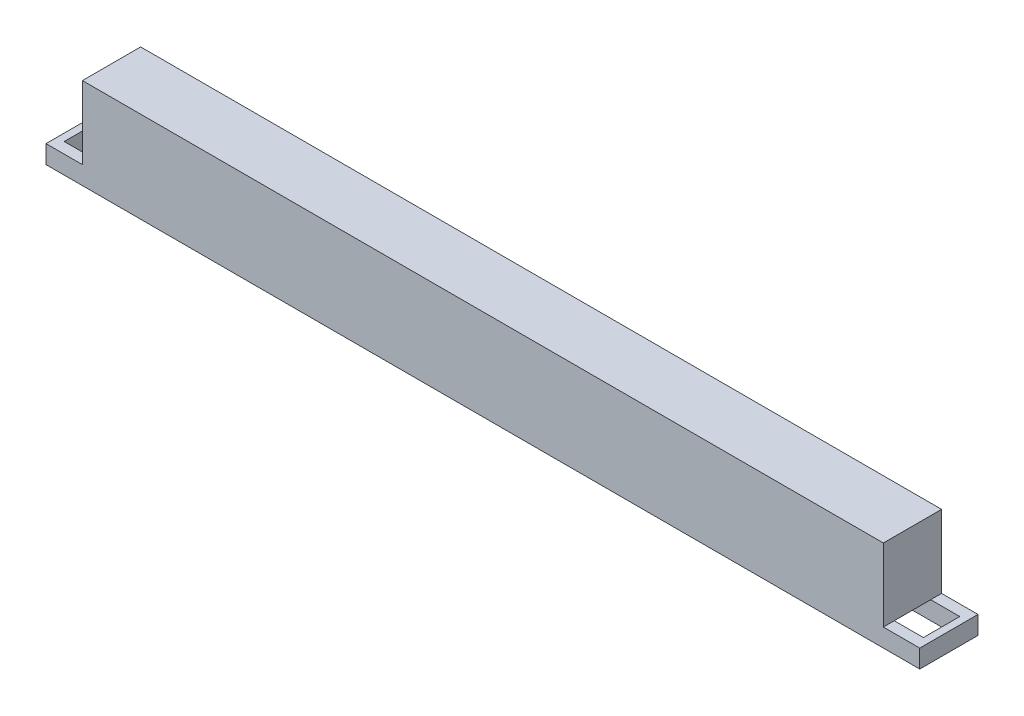
ISO-10303-21;
HEADER;
FILE_DESCRIPTION(('STEP AP214'),'2;1');
FILE_NAME('part.step','',(''),(''),'','','');
FILE_SCHEMA(('AUTOMOTIVE_DESIGN { 1 0 10303 214 1 1 1 1 }'));
ENDSEC;
DATA;
#1=APPLICATION_CONTEXT('core data for automotive mechanical design processes');
#2=APPLICATION_PROTOCOL_DEFINITION('international standard','automotive_design',2000,#1);
#3=PRODUCT_CONTEXT('',#1,'mechanical');
#4=PRODUCT('Part','Part','',(#3));
#5=PRODUCT_RELATED_PRODUCT_CATEGORY('part','',(#4));
#6=PRODUCT_DEFINITION_FORMATION('','',#4);
#7=PRODUCT_DEFINITION_CONTEXT('part definition',#1,'design');
#8=PRODUCT_DEFINITION('design','',#6,#7);
#9=PRODUCT_DEFINITION_SHAPE('','',#8);
#10=(LENGTH_UNIT() NAMED_UNIT(*) SI_UNIT(.MILLI.,.METRE.));
#11=(NAMED_UNIT(*) PLANE_ANGLE_UNIT() SI_UNIT($,.RADIAN.));
#12=(NAMED_UNIT(*) SI_UNIT($,.STERADIAN.) SOLID_ANGLE_UNIT());
#13=UNCERTAINTY_MEASURE_WITH_UNIT(LENGTH_MEASURE(1.E-05),#10,'distance_accuracy_value','');
#14=(GEOMETRIC_REPRESENTATION_CONTEXT(3) GLOBAL_UNCERTAINTY_ASSIGNED_CONTEXT((#13)) GLOBAL_UNIT_ASSIGNED_CONTEXT((#10,
#11,#12)) REPRESENTATION_CONTEXT('',''));
#15=CARTESIAN_POINT('',(0.,0.,0.));
#16=DIRECTION('',(0.,0.,1.));
#17=DIRECTION('',(1.,0.,0.));
#18=AXIS2_PLACEMENT_3D('',#15,#16,#17);
#19=CARTESIAN_POINT('',(0.,5.,0.));
#20=DIRECTION('',(0.,1.,0.));
#21=DIRECTION('',(0.,0.,1.));
#22=AXIS2_PLACEMENT_3D('',#19,#20,#21);
#23=PLANE('',#22);
#24=DIRECTION('',(0.,0.,1.));
#25=VECTOR('',#24,1.);
#26=CARTESIAN_POINT('',(-110.,5.,8.00000000000002));
#27=LINE('',#26,#25);
#28=CARTESIAN_POINT('',(-110.,5.,-7.99999999999999));
#29=VERTEX_POINT('',#28);
#30=CARTESIAN_POINT('',(-110.,5.,-4.99999999999999));
#31=VERTEX_POINT('',#30);
#32=EDGE_CURVE('E47',#29,#31,#27,.T.);
#33=ORIENTED_EDGE('',*,*,#32,.F.);
#34=DIRECTION('',(-1.,0.,0.));
#35=VECTOR('',#34,1.);
#36=CARTESIAN_POINT('',(120.,5.,-8.00000000000002));
#37=LINE('',#36,#35);
#38=CARTESIAN_POINT('',(-120.,5.,-7.99999999999999));
#39=VERTEX_POINT('',#38);
#40=EDGE_CURVE('E216',#29,#39,#37,.T.);
#41=ORIENTED_EDGE('',*,*,#40,.T.);
#42=DIRECTION('',(0.,0.,1.));
#43=VECTOR('',#42,1.);
#44=CARTESIAN_POINT('',(-120.,5.,8.00000000000001));
#45=LINE('',#44,#43);
#46=CARTESIAN_POINT('',(-120.,5.,8.00000000000001));
#47=VERTEX_POINT('',#46);
#48=EDGE_CURVE('E207',#39,#47,#45,.T.);
#49=ORIENTED_EDGE('',*,*,#48,.T.);
#50=DIRECTION('',(1.,0.,0.));
#51=VECTOR('',#50,1.);
#52=CARTESIAN_POINT('',(120.,5.,7.99999999999998));
#53=LINE('',#52,#51);
#54=CARTESIAN_POINT('',(-110.,5.,8.00000000000001));
#55=VERTEX_POINT('',#54);
#56=EDGE_CURVE('E212',#47,#55,#53,.T.);
#57=ORIENTED_EDGE('',*,*,#56,.T.);
#58=CARTESIAN_POINT('',(-110.,5.,5.00000000000001));
#59=VERTEX_POINT('',#58);
#60=EDGE_CURVE('E11',#59,#55,#27,.T.);
#61=ORIENTED_EDGE('',*,*,#60,.F.);
#62=DIRECTION('',(1.,0.,0.));
#63=VECTOR('',#62,1.);
#64=CARTESIAN_POINT('',(118.,5.,4.99999999999999));
#65=LINE('',#64,#63);
#66=CARTESIAN_POINT('',(-118.,5.,5.00000000000002));
#67=VERTEX_POINT('',#66);
#68=EDGE_CURVE('E179',#67,#59,#65,.T.);
#69=ORIENTED_EDGE('',*,*,#68,.F.);
#70=DIRECTION('',(0.,0.,1.));
#71=VECTOR('',#70,1.);
#72=CARTESIAN_POINT('',(-118.,5.,5.00000000000002));
#73=LINE('',#72,#71);
#74=CARTESIAN_POINT('',(-118.,5.,-4.99999999999999));
#75=VERTEX_POINT('',#74);
#76=EDGE_CURVE('E175',#75,#67,#73,.T.);
#77=ORIENTED_EDGE('',*,*,#76,.F.);
#78=DIRECTION('',(-1.,0.,0.));
#79=VECTOR('',#78,1.);
#80=CARTESIAN_POINT('',(118.,5.,-5.00000000000001));
#81=LINE('',#80,#79);
#82=EDGE_CURVE('E55',#31,#75,#81,.T.);
#83=ORIENTED_EDGE('',*,*,#82,.F.);
#84=EDGE_LOOP('',(#33,#41,#49,#57,#61,#69,#77,#83));
#85=FACE_BOUND('',#84,.T.);
#86=ADVANCED_FACE('F36',(#85),#23,.T.);
#87=DIRECTION('',(0.,0.,-1.));
#88=VECTOR('',#87,1.);
#89=CARTESIAN_POINT('',(110.,5.,8.00000000000002));
#90=LINE('',#89,#88);
#91=CARTESIAN_POINT('',(110.,5.,7.99999999999999));
#92=VERTEX_POINT('',#91);
#93=CARTESIAN_POINT('',(110.,5.,5.));
#94=VERTEX_POINT('',#93);
#95=EDGE_CURVE('E161',#92,#94,#90,.T.);
#96=ORIENTED_EDGE('',*,*,#95,.F.);
#97=CARTESIAN_POINT('',(120.,5.,7.99999999999998));
#98=VERTEX_POINT('',#97);
#99=EDGE_CURVE('E210',#92,#98,#53,.T.);
#100=ORIENTED_EDGE('',*,*,#99,.T.);
#101=DIRECTION('',(0.,0.,-1.));
#102=VECTOR('',#101,1.);
#103=CARTESIAN_POINT('',(120.,5.,7.99999999999998));
#104=LINE('',#103,#102);
#105=CARTESIAN_POINT('',(120.,5.,-8.00000000000002));
#106=VERTEX_POINT('',#105);
#107=EDGE_CURVE('E214',#98,#106,#104,.T.);
#108=ORIENTED_EDGE('',*,*,#107,.T.);
#109=CARTESIAN_POINT('',(110.,5.,-8.00000000000002));
#110=VERTEX_POINT('',#109);
#111=EDGE_CURVE('E217',#106,#110,#37,.T.);
#112=ORIENTED_EDGE('',*,*,#111,.T.);
#113=CARTESIAN_POINT('',(110.,5.,-5.00000000000001));
#114=VERTEX_POINT('',#113);
#115=EDGE_CURVE('E45',#114,#110,#90,.T.);
#116=ORIENTED_EDGE('',*,*,#115,.F.);
#117=CARTESIAN_POINT('',(118.,5.,-5.00000000000001));
#118=VERTEX_POINT('',#117);
#119=EDGE_CURVE('E186',#118,#114,#81,.T.);
#120=ORIENTED_EDGE('',*,*,#119,.F.);
#121=DIRECTION('',(0.,0.,-1.));
#122=VECTOR('',#121,1.);
#123=CARTESIAN_POINT('',(118.,5.,4.99999999999999));
#124=LINE('',#123,#122);
#125=CARTESIAN_POINT('',(118.,5.,4.99999999999999));
#126=VERTEX_POINT('',#125);
#127=EDGE_CURVE('E182',#126,#118,#124,.T.);
#128=ORIENTED_EDGE('',*,*,#127,.F.);
#129=EDGE_CURVE('E177',#94,#126,#65,.T.);
#130=ORIENTED_EDGE('',*,*,#129,.F.);
#131=EDGE_LOOP('',(#96,#100,#108,#112,#116,#120,#128,#130));
#132=FACE_BOUND('',#131,.T.);
#133=ADVANCED_FACE('F266',(#132),#23,.T.);
#134=CARTESIAN_POINT('',(0.,0.,0.));
#135=DIRECTION('',(0.,1.,0.));
#136=DIRECTION('',(0.,0.,1.));
#137=AXIS2_PLACEMENT_3D('',#134,#135,#136);
#138=PLANE('',#137);
#139=DIRECTION('',(0.,0.,1.));
#140=VECTOR('',#139,1.);
#141=CARTESIAN_POINT('',(-120.,0.,8.00000000000001));
#142=LINE('',#141,#140);
#143=CARTESIAN_POINT('',(-120.,0.,-7.99999999999999));
#144=VERTEX_POINT('',#143);
#145=CARTESIAN_POINT('',(-120.,0.,8.00000000000001));
#146=VERTEX_POINT('',#145);
#147=EDGE_CURVE('E206',#144,#146,#142,.T.);
#148=ORIENTED_EDGE('',*,*,#147,.F.);
#149=DIRECTION('',(-1.,0.,0.));
#150=VECTOR('',#149,1.);
#151=CARTESIAN_POINT('',(120.,0.,-8.00000000000002));
#152=LINE('',#151,#150);
#153=CARTESIAN_POINT('',(120.,0.,-8.00000000000002));
#154=VERTEX_POINT('',#153);
#155=EDGE_CURVE('E211',#154,#144,#152,.T.);
#156=ORIENTED_EDGE('',*,*,#155,.F.);
#157=DIRECTION('',(0.,0.,-1.));
#158=VECTOR('',#157,1.);
#159=CARTESIAN_POINT('',(120.,0.,7.99999999999998));
#160=LINE('',#159,#158);
#161=CARTESIAN_POINT('',(120.,0.,7.99999999999998));
#162=VERTEX_POINT('',#161);
#163=EDGE_CURVE('E224',#162,#154,#160,.T.);
#164=ORIENTED_EDGE('',*,*,#163,.F.);
#165=DIRECTION('',(1.,0.,0.));
#166=VECTOR('',#165,1.);
#167=CARTESIAN_POINT('',(120.,0.,7.99999999999998));
#168=LINE('',#167,#166);
#169=EDGE_CURVE('E222',#146,#162,#168,.T.);
#170=ORIENTED_EDGE('',*,*,#169,.F.);
#171=EDGE_LOOP('',(#148,#156,#164,#170));
#172=FACE_BOUND('',#171,.T.);
#173=DIRECTION('',(0.,0.,1.));
#174=VECTOR('',#173,1.);
#175=CARTESIAN_POINT('',(-118.,0.,5.00000000000002));
#176=LINE('',#175,#174);
#177=CARTESIAN_POINT('',(-118.,0.,-4.99999999999999));
#178=VERTEX_POINT('',#177);
#179=CARTESIAN_POINT('',(-118.,0.,5.00000000000002));
#180=VERTEX_POINT('',#179);
#181=EDGE_CURVE('E166',#178,#180,#176,.T.);
#182=ORIENTED_EDGE('',*,*,#181,.T.);
#183=DIRECTION('',(1.,0.,0.));
#184=VECTOR('',#183,1.);
#185=CARTESIAN_POINT('',(118.,0.,4.99999999999999));
#186=LINE('',#185,#184);
#187=CARTESIAN_POINT('',(118.,0.,4.99999999999999));
#188=VERTEX_POINT('',#187);
#189=EDGE_CURVE('E169',#180,#188,#186,.T.);
#190=ORIENTED_EDGE('',*,*,#189,.T.);
#191=DIRECTION('',(0.,0.,-1.));
#192=VECTOR('',#191,1.);
#193=CARTESIAN_POINT('',(118.,0.,4.99999999999999));
#194=LINE('',#193,#192);
#195=CARTESIAN_POINT('',(118.,0.,-5.00000000000001));
#196=VERTEX_POINT('',#195);
#197=EDGE_CURVE('E192',#188,#196,#194,.T.);
#198=ORIENTED_EDGE('',*,*,#197,.T.);
#199=DIRECTION('',(-1.,0.,0.));
#200=VECTOR('',#199,1.);
#201=CARTESIAN_POINT('',(118.,0.,-5.00000000000001));
#202=LINE('',#201,#200);
#203=EDGE_CURVE('E178',#196,#178,#202,.T.);
#204=ORIENTED_EDGE('',*,*,#203,.T.);
#205=EDGE_LOOP('',(#182,#190,#198,#204));
#206=FACE_BOUND('',#205,.T.);
#207=ADVANCED_FACE('F262',(#172,#206),#138,.F.);
#208=CARTESIAN_POINT('',(-120.,5.,8.00000000000001));
#209=DIRECTION('',(1.,0.,0.));
#210=DIRECTION('',(0.,0.,-1.));
#211=AXIS2_PLACEMENT_3D('',#208,#209,#210);
#212=PLANE('',#211);
#213=ORIENTED_EDGE('',*,*,#147,.T.);
#214=DIRECTION('',(0.,-1.,0.));
#215=VECTOR('',#214,1.);
#216=CARTESIAN_POINT('',(-120.,5.,8.00000000000001));
#217=LINE('',#216,#215);
#218=EDGE_CURVE('E40',#47,#146,#217,.T.);
#219=ORIENTED_EDGE('',*,*,#218,.F.);
#220=ORIENTED_EDGE('',*,*,#48,.F.);
#221=DIRECTION('',(0.,-1.,0.));
#222=VECTOR('',#221,1.);
#223=CARTESIAN_POINT('',(-120.,5.,-7.99999999999999));
#224=LINE('',#223,#222);
#225=EDGE_CURVE('E219',#39,#144,#224,.T.);
#226=ORIENTED_EDGE('',*,*,#225,.T.);
#227=EDGE_LOOP('',(#213,#219,#220,#226));
#228=FACE_BOUND('',#227,.T.);
#229=ADVANCED_FACE('F38',(#228),#212,.F.);
#230=CARTESIAN_POINT('',(120.,5.,7.99999999999998));
#231=DIRECTION('',(0.,0.,-1.));
#232=DIRECTION('',(-1.,0.,0.));
#233=AXIS2_PLACEMENT_3D('',#230,#231,#232);
#234=PLANE('',#233);
#235=ORIENTED_EDGE('',*,*,#169,.T.);
#236=DIRECTION('',(0.,-1.,0.));
#237=VECTOR('',#236,1.);
#238=CARTESIAN_POINT('',(120.,5.,7.99999999999998));
#239=LINE('',#238,#237);
#240=EDGE_CURVE('E231',#98,#162,#239,.T.);
#241=ORIENTED_EDGE('',*,*,#240,.F.);
#242=ORIENTED_EDGE('',*,*,#99,.F.);
#243=DIRECTION('',(0.,-1.,0.));
#244=VECTOR('',#243,1.);
#245=CARTESIAN_POINT('',(110.,25.,8.00000000000002));
#246=LINE('',#245,#244);
#247=CARTESIAN_POINT('',(110.,25.,8.00000000000002));
#248=VERTEX_POINT('',#247);
#249=EDGE_CURVE('E148',#248,#92,#246,.T.);
#250=ORIENTED_EDGE('',*,*,#249,.F.);
#251=DIRECTION('',(1.,0.,0.));
#252=VECTOR('',#251,1.);
#253=CARTESIAN_POINT('',(110.,25.,8.00000000000002));
#254=LINE('',#253,#252);
#255=CARTESIAN_POINT('',(-110.,25.,8.00000000000002));
#256=VERTEX_POINT('',#255);
#257=EDGE_CURVE('E141',#256,#248,#254,.T.);
#258=ORIENTED_EDGE('',*,*,#257,.F.);
#259=DIRECTION('',(0.,-1.,0.));
#260=VECTOR('',#259,1.);
#261=CARTESIAN_POINT('',(-110.,25.,8.00000000000002));
#262=LINE('',#261,#260);
#263=EDGE_CURVE('E145',#256,#55,#262,.T.);
#264=ORIENTED_EDGE('',*,*,#263,.T.);
#265=ORIENTED_EDGE('',*,*,#56,.F.);
#266=ORIENTED_EDGE('',*,*,#218,.T.);
#267=EDGE_LOOP('',(#235,#241,#242,#250,#258,#264,#265,#266));
#268=FACE_BOUND('',#267,.T.);
#269=ADVANCED_FACE('F143',(#268),#234,.F.);
#270=CARTESIAN_POINT('',(120.,5.,7.99999999999998));
#271=DIRECTION('',(-1.,0.,0.));
#272=DIRECTION('',(0.,0.,1.));
#273=AXIS2_PLACEMENT_3D('',#270,#271,#272);
#274=PLANE('',#273);
#275=ORIENTED_EDGE('',*,*,#163,.T.);
#276=DIRECTION('',(0.,-1.,0.));
#277=VECTOR('',#276,1.);
#278=CARTESIAN_POINT('',(120.,5.,-8.00000000000002));
#279=LINE('',#278,#277);
#280=EDGE_CURVE('E229',#106,#154,#279,.T.);
#281=ORIENTED_EDGE('',*,*,#280,.F.);
#282=ORIENTED_EDGE('',*,*,#107,.F.);
#283=ORIENTED_EDGE('',*,*,#240,.T.);
#284=EDGE_LOOP('',(#275,#281,#282,#283));
#285=FACE_BOUND('',#284,.T.);
#286=ADVANCED_FACE('F265',(#285),#274,.F.);
#287=CARTESIAN_POINT('',(120.,5.,-8.00000000000002));
#288=DIRECTION('',(0.,0.,1.));
#289=DIRECTION('',(1.,0.,0.));
#290=AXIS2_PLACEMENT_3D('',#287,#288,#289);
#291=PLANE('',#290);
#292=ORIENTED_EDGE('',*,*,#155,.T.);
#293=ORIENTED_EDGE('',*,*,#225,.F.);
#294=ORIENTED_EDGE('',*,*,#40,.F.);
#295=DIRECTION('',(0.,-1.,0.));
#296=VECTOR('',#295,1.);
#297=CARTESIAN_POINT('',(-110.,25.,-8.00000000000002));
#298=LINE('',#297,#296);
#299=CARTESIAN_POINT('',(-110.,25.,-8.00000000000002));
#300=VERTEX_POINT('',#299);
#301=EDGE_CURVE('E250',#300,#29,#298,.T.);
#302=ORIENTED_EDGE('',*,*,#301,.F.);
#303=DIRECTION('',(-1.,0.,0.));
#304=VECTOR('',#303,1.);
#305=CARTESIAN_POINT('',(110.,25.,-8.00000000000002));
#306=LINE('',#305,#304);
#307=CARTESIAN_POINT('',(110.,25.,-8.00000000000002));
#308=VERTEX_POINT('',#307);
#309=EDGE_CURVE('E157',#308,#300,#306,.T.);
#310=ORIENTED_EDGE('',*,*,#309,.F.);
#311=DIRECTION('',(0.,-1.,0.));
#312=VECTOR('',#311,1.);
#313=CARTESIAN_POINT('',(110.,25.,-8.00000000000002));
#314=LINE('',#313,#312);
#315=EDGE_CURVE('E171',#308,#110,#314,.T.);
#316=ORIENTED_EDGE('',*,*,#315,.T.);
#317=ORIENTED_EDGE('',*,*,#111,.F.);
#318=ORIENTED_EDGE('',*,*,#280,.T.);
#319=EDGE_LOOP('',(#292,#293,#294,#302,#310,#316,#317,#318));
#320=FACE_BOUND('',#319,.T.);
#321=ADVANCED_FACE('F254',(#320),#291,.F.);
#322=CARTESIAN_POINT('',(-118.,5.,5.00000000000002));
#323=DIRECTION('',(1.,0.,0.));
#324=DIRECTION('',(0.,0.,-1.));
#325=AXIS2_PLACEMENT_3D('',#322,#323,#324);
#326=PLANE('',#325);
#327=ORIENTED_EDGE('',*,*,#181,.F.);
#328=DIRECTION('',(0.,-1.,0.));
#329=VECTOR('',#328,1.);
#330=CARTESIAN_POINT('',(-118.,5.,-4.99999999999999));
#331=LINE('',#330,#329);
#332=EDGE_CURVE('E187',#75,#178,#331,.T.);
#333=ORIENTED_EDGE('',*,*,#332,.F.);
#334=ORIENTED_EDGE('',*,*,#76,.T.);
#335=DIRECTION('',(0.,-1.,0.));
#336=VECTOR('',#335,1.);
#337=CARTESIAN_POINT('',(-118.,5.,5.00000000000002));
#338=LINE('',#337,#336);
#339=EDGE_CURVE('E203',#67,#180,#338,.T.);
#340=ORIENTED_EDGE('',*,*,#339,.T.);
#341=EDGE_LOOP('',(#327,#333,#334,#340));
#342=FACE_BOUND('',#341,.T.);
#343=ADVANCED_FACE('F281',(#342),#326,.T.);
#344=CARTESIAN_POINT('',(118.,5.,4.99999999999999));
#345=DIRECTION('',(0.,0.,-1.));
#346=DIRECTION('',(-1.,0.,0.));
#347=AXIS2_PLACEMENT_3D('',#344,#345,#346);
#348=PLANE('',#347);
#349=ORIENTED_EDGE('',*,*,#189,.F.);
#350=ORIENTED_EDGE('',*,*,#339,.F.);
#351=ORIENTED_EDGE('',*,*,#68,.T.);
#352=EDGE_CURVE('E183',#59,#94,#65,.T.);
#353=ORIENTED_EDGE('',*,*,#352,.T.);
#354=ORIENTED_EDGE('',*,*,#129,.T.);
#355=DIRECTION('',(0.,-1.,0.));
#356=VECTOR('',#355,1.);
#357=CARTESIAN_POINT('',(118.,5.,4.99999999999999));
#358=LINE('',#357,#356);
#359=EDGE_CURVE('E201',#126,#188,#358,.T.);
#360=ORIENTED_EDGE('',*,*,#359,.T.);
#361=EDGE_LOOP('',(#349,#350,#351,#353,#354,#360));
#362=FACE_BOUND('',#361,.T.);
#363=ADVANCED_FACE('F284',(#362),#348,.T.);
#364=CARTESIAN_POINT('',(118.,5.,4.99999999999999));
#365=DIRECTION('',(-1.,0.,0.));
#366=DIRECTION('',(0.,0.,1.));
#367=AXIS2_PLACEMENT_3D('',#364,#365,#366);
#368=PLANE('',#367);
#369=ORIENTED_EDGE('',*,*,#197,.F.);
#370=ORIENTED_EDGE('',*,*,#359,.F.);
#371=ORIENTED_EDGE('',*,*,#127,.T.);
#372=DIRECTION('',(0.,-1.,0.));
#373=VECTOR('',#372,1.);
#374=CARTESIAN_POINT('',(118.,5.,-5.00000000000001));
#375=LINE('',#374,#373);
#376=EDGE_CURVE('E199',#118,#196,#375,.T.);
#377=ORIENTED_EDGE('',*,*,#376,.T.);
#378=EDGE_LOOP('',(#369,#370,#371,#377));
#379=FACE_BOUND('',#378,.T.);
#380=ADVANCED_FACE('F287',(#379),#368,.T.);
#381=CARTESIAN_POINT('',(118.,5.,-5.00000000000001));
#382=DIRECTION('',(0.,0.,1.));
#383=DIRECTION('',(1.,0.,0.));
#384=AXIS2_PLACEMENT_3D('',#381,#382,#383);
#385=PLANE('',#384);
#386=ORIENTED_EDGE('',*,*,#203,.F.);
#387=ORIENTED_EDGE('',*,*,#376,.F.);
#388=ORIENTED_EDGE('',*,*,#119,.T.);
#389=EDGE_CURVE('E188',#114,#31,#81,.T.);
#390=ORIENTED_EDGE('',*,*,#389,.T.);
#391=ORIENTED_EDGE('',*,*,#82,.T.);
#392=ORIENTED_EDGE('',*,*,#332,.T.);
#393=EDGE_LOOP('',(#386,#387,#388,#390,#391,#392));
#394=FACE_BOUND('',#393,.T.);
#395=ADVANCED_FACE('F279',(#394),#385,.T.);
#396=CARTESIAN_POINT('',(-110.,25.,8.00000000000002));
#397=DIRECTION('',(1.,0.,0.));
#398=DIRECTION('',(0.,0.,-1.));
#399=AXIS2_PLACEMENT_3D('',#396,#397,#398);
#400=PLANE('',#399);
#401=ORIENTED_EDGE('',*,*,#32,.T.);
#402=EDGE_CURVE('E48',#31,#59,#27,.T.);
#403=ORIENTED_EDGE('',*,*,#402,.T.);
#404=ORIENTED_EDGE('',*,*,#60,.T.);
#405=ORIENTED_EDGE('',*,*,#263,.F.);
#406=DIRECTION('',(0.,0.,1.));
#407=VECTOR('',#406,1.);
#408=CARTESIAN_POINT('',(-110.,25.,8.00000000000002));
#409=LINE('',#408,#407);
#410=EDGE_CURVE('E152',#300,#256,#409,.T.);
#411=ORIENTED_EDGE('',*,*,#410,.F.);
#412=ORIENTED_EDGE('',*,*,#301,.T.);
#413=EDGE_LOOP('',(#401,#403,#404,#405,#411,#412));
#414=FACE_BOUND('',#413,.T.);
#415=ADVANCED_FACE('F164',(#414),#400,.F.);
#416=CARTESIAN_POINT('',(110.,25.,8.00000000000002));
#417=DIRECTION('',(-1.,0.,0.));
#418=DIRECTION('',(0.,0.,1.));
#419=AXIS2_PLACEMENT_3D('',#416,#417,#418);
#420=PLANE('',#419);
#421=ORIENTED_EDGE('',*,*,#95,.T.);
#422=EDGE_CURVE('E240',#94,#114,#90,.T.);
#423=ORIENTED_EDGE('',*,*,#422,.T.);
#424=ORIENTED_EDGE('',*,*,#115,.T.);
#425=ORIENTED_EDGE('',*,*,#315,.F.);
#426=DIRECTION('',(0.,0.,-1.));
#427=VECTOR('',#426,1.);
#428=CARTESIAN_POINT('',(110.,25.,8.00000000000002));
#429=LINE('',#428,#427);
#430=EDGE_CURVE('E151',#248,#308,#429,.T.);
#431=ORIENTED_EDGE('',*,*,#430,.F.);
#432=ORIENTED_EDGE('',*,*,#249,.T.);
#433=EDGE_LOOP('',(#421,#423,#424,#425,#431,#432));
#434=FACE_BOUND('',#433,.T.);
#435=ADVANCED_FACE('F251',(#434),#420,.F.);
#436=CARTESIAN_POINT('',(0.,25.,0.));
#437=DIRECTION('',(0.,1.,0.));
#438=DIRECTION('',(0.,0.,1.));
#439=AXIS2_PLACEMENT_3D('',#436,#437,#438);
#440=PLANE('',#439);
#441=ORIENTED_EDGE('',*,*,#410,.T.);
#442=ORIENTED_EDGE('',*,*,#257,.T.);
#443=ORIENTED_EDGE('',*,*,#430,.T.);
#444=ORIENTED_EDGE('',*,*,#309,.T.);
#445=EDGE_LOOP('',(#441,#442,#443,#444));
#446=FACE_BOUND('',#445,.T.);
#447=ADVANCED_FACE('F155',(#446),#440,.T.);
#448=CARTESIAN_POINT('',(0.,5.,0.));
#449=DIRECTION('',(0.,1.,0.));
#450=DIRECTION('',(0.,0.,1.));
#451=AXIS2_PLACEMENT_3D('',#448,#449,#450);
#452=PLANE('',#451);
#453=ORIENTED_EDGE('',*,*,#352,.F.);
#454=ORIENTED_EDGE('',*,*,#402,.F.);
#455=ORIENTED_EDGE('',*,*,#389,.F.);
#456=ORIENTED_EDGE('',*,*,#422,.F.);
#457=EDGE_LOOP('',(#453,#454,#455,#456));
#458=FACE_BOUND('',#457,.T.);
#459=ADVANCED_FACE('F274',(#458),#452,.F.);
#460=CLOSED_SHELL('',(#86,#133,#207,#229,#269,#286,#321,#343,#363,#380,#395,#415,#435,#447,#459));
#461=MANIFOLD_SOLID_BREP('B2',#460);
#462=ADVANCED_BREP_SHAPE_REPRESENTATION('',(#18,#461),#14);
#463=SHAPE_DEFINITION_REPRESENTATION(#9,#462);
ENDSEC;
END-ISO-10303-21;
